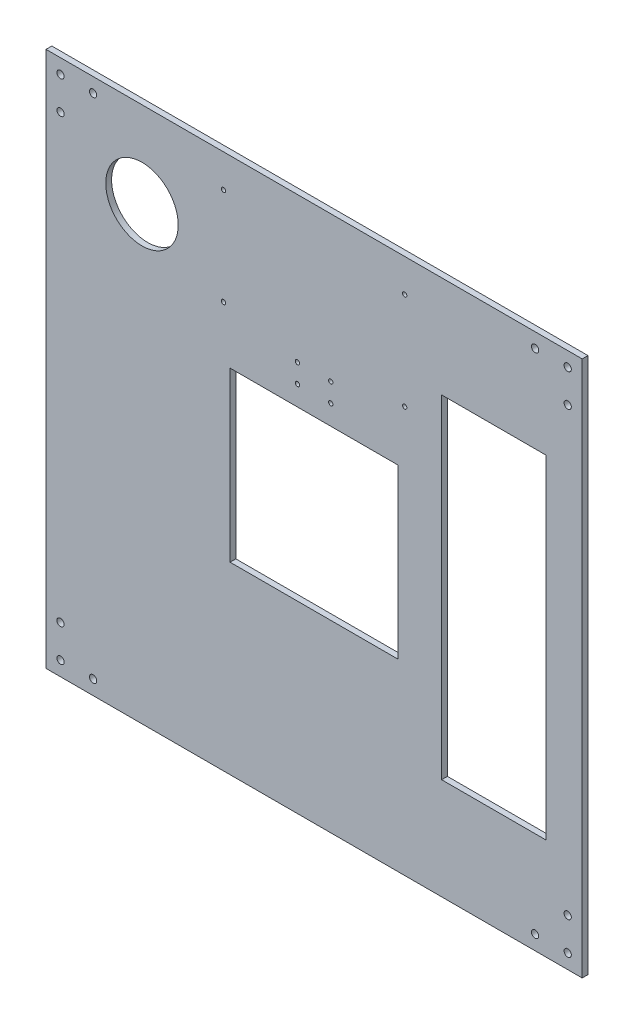
ISO-10303-21;
HEADER;
FILE_DESCRIPTION(('STEP AP214'),'2;1');
FILE_NAME('part.step','',(''),(''),'','','');
FILE_SCHEMA(('AUTOMOTIVE_DESIGN { 1 0 10303 214 1 1 1 1 }'));
ENDSEC;
DATA;
#1=APPLICATION_CONTEXT('core data for automotive mechanical design processes');
#2=APPLICATION_PROTOCOL_DEFINITION('international standard','automotive_design',2000,#1);
#3=PRODUCT_CONTEXT('',#1,'mechanical');
#4=PRODUCT('Part','Part','',(#3));
#5=PRODUCT_RELATED_PRODUCT_CATEGORY('part','',(#4));
#6=PRODUCT_DEFINITION_FORMATION('','',#4);
#7=PRODUCT_DEFINITION_CONTEXT('part definition',#1,'design');
#8=PRODUCT_DEFINITION('design','',#6,#7);
#9=PRODUCT_DEFINITION_SHAPE('','',#8);
#10=(LENGTH_UNIT() NAMED_UNIT(*) SI_UNIT(.MILLI.,.METRE.));
#11=(NAMED_UNIT(*) PLANE_ANGLE_UNIT() SI_UNIT($,.RADIAN.));
#12=(NAMED_UNIT(*) SI_UNIT($,.STERADIAN.) SOLID_ANGLE_UNIT());
#13=UNCERTAINTY_MEASURE_WITH_UNIT(LENGTH_MEASURE(1.E-05),#10,'distance_accuracy_value','');
#14=(GEOMETRIC_REPRESENTATION_CONTEXT(3) GLOBAL_UNCERTAINTY_ASSIGNED_CONTEXT((#13)) GLOBAL_UNIT_ASSIGNED_CONTEXT((#10,
#11,#12)) REPRESENTATION_CONTEXT('',''));
#15=CARTESIAN_POINT('',(0.,0.,0.));
#16=DIRECTION('',(0.,0.,1.));
#17=DIRECTION('',(1.,0.,0.));
#18=AXIS2_PLACEMENT_3D('',#15,#16,#17);
#19=CARTESIAN_POINT('',(-185.,-185.,4.));
#20=DIRECTION('',(1.,0.,0.));
#21=DIRECTION('',(0.,0.,-1.));
#22=AXIS2_PLACEMENT_3D('',#19,#20,#21);
#23=PLANE('',#22);
#24=DIRECTION('',(0.,-1.,0.));
#25=VECTOR('',#24,1.);
#26=CARTESIAN_POINT('',(-185.,-185.,0.));
#27=LINE('',#26,#25);
#28=CARTESIAN_POINT('',(-185.,185.,0.));
#29=VERTEX_POINT('',#28);
#30=CARTESIAN_POINT('',(-185.,-185.,0.));
#31=VERTEX_POINT('',#30);
#32=EDGE_CURVE('E289',#29,#31,#27,.T.);
#33=ORIENTED_EDGE('',*,*,#32,.T.);
#34=DIRECTION('',(0.,0.,-1.));
#35=VECTOR('',#34,1.);
#36=CARTESIAN_POINT('',(-185.,-185.,4.));
#37=LINE('',#36,#35);
#38=CARTESIAN_POINT('',(-185.,-185.,4.));
#39=VERTEX_POINT('',#38);
#40=EDGE_CURVE('E11',#39,#31,#37,.T.);
#41=ORIENTED_EDGE('',*,*,#40,.F.);
#42=DIRECTION('',(0.,-1.,0.));
#43=VECTOR('',#42,1.);
#44=CARTESIAN_POINT('',(-185.,-185.,4.));
#45=LINE('',#44,#43);
#46=CARTESIAN_POINT('',(-185.,185.,4.));
#47=VERTEX_POINT('',#46);
#48=EDGE_CURVE('E292',#47,#39,#45,.T.);
#49=ORIENTED_EDGE('',*,*,#48,.F.);
#50=DIRECTION('',(0.,0.,-1.));
#51=VECTOR('',#50,1.);
#52=CARTESIAN_POINT('',(-185.,185.,4.));
#53=LINE('',#52,#51);
#54=EDGE_CURVE('E302',#47,#29,#53,.T.);
#55=ORIENTED_EDGE('',*,*,#54,.T.);
#56=EDGE_LOOP('',(#33,#41,#49,#55));
#57=FACE_BOUND('',#56,.T.);
#58=ADVANCED_FACE('F37',(#57),#23,.F.);
#59=CARTESIAN_POINT('',(185.,-185.,4.));
#60=DIRECTION('',(0.,1.,0.));
#61=DIRECTION('',(-1.,0.,0.));
#62=AXIS2_PLACEMENT_3D('',#59,#60,#61);
#63=PLANE('',#62);
#64=DIRECTION('',(1.,0.,0.));
#65=VECTOR('',#64,1.);
#66=CARTESIAN_POINT('',(185.,-185.,0.));
#67=LINE('',#66,#65);
#68=CARTESIAN_POINT('',(185.,-185.,0.));
#69=VERTEX_POINT('',#68);
#70=EDGE_CURVE('E305',#31,#69,#67,.T.);
#71=ORIENTED_EDGE('',*,*,#70,.T.);
#72=DIRECTION('',(0.,0.,-1.));
#73=VECTOR('',#72,1.);
#74=CARTESIAN_POINT('',(185.,-185.,4.));
#75=LINE('',#74,#73);
#76=CARTESIAN_POINT('',(185.,-185.,4.));
#77=VERTEX_POINT('',#76);
#78=EDGE_CURVE('E44',#77,#69,#75,.T.);
#79=ORIENTED_EDGE('',*,*,#78,.F.);
#80=DIRECTION('',(1.,0.,0.));
#81=VECTOR('',#80,1.);
#82=CARTESIAN_POINT('',(185.,-185.,4.));
#83=LINE('',#82,#81);
#84=EDGE_CURVE('E295',#39,#77,#83,.T.);
#85=ORIENTED_EDGE('',*,*,#84,.F.);
#86=ORIENTED_EDGE('',*,*,#40,.T.);
#87=EDGE_LOOP('',(#71,#79,#85,#86));
#88=FACE_BOUND('',#87,.T.);
#89=ADVANCED_FACE('F334',(#88),#63,.F.);
#90=CARTESIAN_POINT('',(185.,-185.,4.));
#91=DIRECTION('',(-1.,0.,0.));
#92=DIRECTION('',(0.,0.,1.));
#93=AXIS2_PLACEMENT_3D('',#90,#91,#92);
#94=PLANE('',#93);
#95=DIRECTION('',(0.,1.,0.));
#96=VECTOR('',#95,1.);
#97=CARTESIAN_POINT('',(185.,-185.,0.));
#98=LINE('',#97,#96);
#99=CARTESIAN_POINT('',(185.,185.,0.));
#100=VERTEX_POINT('',#99);
#101=EDGE_CURVE('E307',#69,#100,#98,.T.);
#102=ORIENTED_EDGE('',*,*,#101,.T.);
#103=DIRECTION('',(0.,0.,-1.));
#104=VECTOR('',#103,1.);
#105=CARTESIAN_POINT('',(185.,185.,4.));
#106=LINE('',#105,#104);
#107=CARTESIAN_POINT('',(185.,185.,4.));
#108=VERTEX_POINT('',#107);
#109=EDGE_CURVE('E312',#108,#100,#106,.T.);
#110=ORIENTED_EDGE('',*,*,#109,.F.);
#111=DIRECTION('',(0.,1.,0.));
#112=VECTOR('',#111,1.);
#113=CARTESIAN_POINT('',(185.,-185.,4.));
#114=LINE('',#113,#112);
#115=EDGE_CURVE('E298',#77,#108,#114,.T.);
#116=ORIENTED_EDGE('',*,*,#115,.F.);
#117=ORIENTED_EDGE('',*,*,#78,.T.);
#118=EDGE_LOOP('',(#102,#110,#116,#117));
#119=FACE_BOUND('',#118,.T.);
#120=ADVANCED_FACE('F319',(#119),#94,.F.);
#121=CARTESIAN_POINT('',(185.,185.,4.));
#122=DIRECTION('',(0.,-1.,0.));
#123=DIRECTION('',(1.,0.,0.));
#124=AXIS2_PLACEMENT_3D('',#121,#122,#123);
#125=PLANE('',#124);
#126=DIRECTION('',(-1.,0.,0.));
#127=VECTOR('',#126,1.);
#128=CARTESIAN_POINT('',(185.,185.,0.));
#129=LINE('',#128,#127);
#130=EDGE_CURVE('E296',#100,#29,#129,.T.);
#131=ORIENTED_EDGE('',*,*,#130,.T.);
#132=ORIENTED_EDGE('',*,*,#54,.F.);
#133=DIRECTION('',(-1.,0.,0.));
#134=VECTOR('',#133,1.);
#135=CARTESIAN_POINT('',(185.,185.,4.));
#136=LINE('',#135,#134);
#137=EDGE_CURVE('E300',#108,#47,#136,.T.);
#138=ORIENTED_EDGE('',*,*,#137,.F.);
#139=ORIENTED_EDGE('',*,*,#109,.T.);
#140=EDGE_LOOP('',(#131,#132,#138,#139));
#141=FACE_BOUND('',#140,.T.);
#142=ADVANCED_FACE('F327',(#141),#125,.F.);
#143=CARTESIAN_POINT('',(0.,0.,4.));
#144=DIRECTION('',(0.,0.,1.));
#145=DIRECTION('',(1.,0.,0.));
#146=AXIS2_PLACEMENT_3D('',#143,#144,#145);
#147=PLANE('',#146);
#148=CARTESIAN_POINT('',(-11.5,71.7320508075689,4.));
#149=DIRECTION('',(0.,0.,-1.));
#150=DIRECTION('',(-1.,0.,0.));
#151=AXIS2_PLACEMENT_3D('',#148,#149,#150);
#152=CIRCLE('',#151,1.5);
#153=CARTESIAN_POINT('',(-13.,71.7320508075689,4.));
#154=VERTEX_POINT('',#153);
#155=EDGE_CURVE('E481',#154,#154,#152,.T.);
#156=ORIENTED_EDGE('',*,*,#155,.T.);
#157=EDGE_LOOP('',(#156));
#158=FACE_BOUND('',#157,.T.);
#159=CARTESIAN_POINT('',(11.5,84.7320508075689,4.));
#160=DIRECTION('',(0.,0.,-1.));
#161=DIRECTION('',(-1.,0.,0.));
#162=AXIS2_PLACEMENT_3D('',#159,#160,#161);
#163=CIRCLE('',#162,1.5);
#164=CARTESIAN_POINT('',(10.,84.7320508075689,4.));
#165=VERTEX_POINT('',#164);
#166=EDGE_CURVE('E470',#165,#165,#163,.T.);
#167=ORIENTED_EDGE('',*,*,#166,.T.);
#168=EDGE_LOOP('',(#167));
#169=FACE_BOUND('',#168,.T.);
#170=CARTESIAN_POINT('',(-11.5,84.7320508075689,4.));
#171=DIRECTION('',(0.,0.,-1.));
#172=DIRECTION('',(-1.,0.,0.));
#173=AXIS2_PLACEMENT_3D('',#170,#171,#172);
#174=CIRCLE('',#173,1.5);
#175=CARTESIAN_POINT('',(-13.,84.7320508075689,4.));
#176=VERTEX_POINT('',#175);
#177=EDGE_CURVE('E465',#176,#176,#174,.T.);
#178=ORIENTED_EDGE('',*,*,#177,.T.);
#179=EDGE_LOOP('',(#178));
#180=FACE_BOUND('',#179,.T.);
#181=CARTESIAN_POINT('',(11.5,71.7320508075689,4.));
#182=DIRECTION('',(0.,0.,-1.));
#183=DIRECTION('',(-1.,0.,0.));
#184=AXIS2_PLACEMENT_3D('',#181,#182,#183);
#185=CIRCLE('',#184,1.5);
#186=CARTESIAN_POINT('',(10.,71.7320508075689,4.));
#187=VERTEX_POINT('',#186);
#188=EDGE_CURVE('E486',#187,#187,#185,.T.);
#189=ORIENTED_EDGE('',*,*,#188,.T.);
#190=EDGE_LOOP('',(#189));
#191=FACE_BOUND('',#190,.T.);
#192=DIRECTION('',(0.,1.,0.));
#193=VECTOR('',#192,1.);
#194=CARTESIAN_POINT('',(160.,0.,4.));
#195=LINE('',#194,#193);
#196=CARTESIAN_POINT('',(160.,-115.,4.));
#197=VERTEX_POINT('',#196);
#198=CARTESIAN_POINT('',(160.,115.,4.));
#199=VERTEX_POINT('',#198);
#200=EDGE_CURVE('E158',#197,#199,#195,.T.);
#201=ORIENTED_EDGE('',*,*,#200,.F.);
#202=DIRECTION('',(1.,0.,0.));
#203=VECTOR('',#202,1.);
#204=CARTESIAN_POINT('',(0.,-115.,4.));
#205=LINE('',#204,#203);
#206=CARTESIAN_POINT('',(88.,-115.,4.));
#207=VERTEX_POINT('',#206);
#208=EDGE_CURVE('E151',#207,#197,#205,.T.);
#209=ORIENTED_EDGE('',*,*,#208,.F.);
#210=DIRECTION('',(0.,-1.,0.));
#211=VECTOR('',#210,1.);
#212=CARTESIAN_POINT('',(88.,0.,4.));
#213=LINE('',#212,#211);
#214=CARTESIAN_POINT('',(88.,115.,4.));
#215=VERTEX_POINT('',#214);
#216=EDGE_CURVE('E131',#215,#207,#213,.T.);
#217=ORIENTED_EDGE('',*,*,#216,.F.);
#218=DIRECTION('',(-1.,0.,0.));
#219=VECTOR('',#218,1.);
#220=CARTESIAN_POINT('',(0.,115.,4.));
#221=LINE('',#220,#219);
#222=EDGE_CURVE('E156',#199,#215,#221,.T.);
#223=ORIENTED_EDGE('',*,*,#222,.F.);
#224=EDGE_LOOP('',(#201,#209,#217,#223));
#225=FACE_BOUND('',#224,.T.);
#226=DIRECTION('',(0.,1.,0.));
#227=VECTOR('',#226,1.);
#228=CARTESIAN_POINT('',(58.,0.,4.));
#229=LINE('',#228,#227);
#230=CARTESIAN_POINT('',(58.,-58.,4.));
#231=VERTEX_POINT('',#230);
#232=CARTESIAN_POINT('',(58.,58.,4.));
#233=VERTEX_POINT('',#232);
#234=EDGE_CURVE('E187',#231,#233,#229,.T.);
#235=ORIENTED_EDGE('',*,*,#234,.F.);
#236=DIRECTION('',(1.,0.,0.));
#237=VECTOR('',#236,1.);
#238=CARTESIAN_POINT('',(0.,-58.,4.));
#239=LINE('',#238,#237);
#240=CARTESIAN_POINT('',(-58.,-58.,4.));
#241=VERTEX_POINT('',#240);
#242=EDGE_CURVE('E174',#241,#231,#239,.T.);
#243=ORIENTED_EDGE('',*,*,#242,.F.);
#244=DIRECTION('',(0.,-1.,0.));
#245=VECTOR('',#244,1.);
#246=CARTESIAN_POINT('',(-58.,0.,4.));
#247=LINE('',#246,#245);
#248=CARTESIAN_POINT('',(-58.,58.,4.));
#249=VERTEX_POINT('',#248);
#250=EDGE_CURVE('E182',#249,#241,#247,.T.);
#251=ORIENTED_EDGE('',*,*,#250,.F.);
#252=DIRECTION('',(-1.,0.,0.));
#253=VECTOR('',#252,1.);
#254=CARTESIAN_POINT('',(0.,58.,4.));
#255=LINE('',#254,#253);
#256=EDGE_CURVE('E185',#233,#249,#255,.T.);
#257=ORIENTED_EDGE('',*,*,#256,.F.);
#258=EDGE_LOOP('',(#235,#243,#251,#257));
#259=FACE_BOUND('',#258,.T.);
#260=CARTESIAN_POINT('',(-118.76985494899,125.631801741306,4.));
#261=DIRECTION('',(0.,0.,-1.));
#262=DIRECTION('',(-1.,0.,0.));
#263=AXIS2_PLACEMENT_3D('',#260,#261,#262);
#264=CIRCLE('',#263,25.);
#265=CARTESIAN_POINT('',(-143.76985494899,125.631801741306,4.));
#266=VERTEX_POINT('',#265);
#267=EDGE_CURVE('E190',#266,#266,#264,.T.);
#268=ORIENTED_EDGE('',*,*,#267,.T.);
#269=EDGE_LOOP('',(#268));
#270=FACE_BOUND('',#269,.T.);
#271=CARTESIAN_POINT('',(-62.5,95.2497952517391,4.));
#272=DIRECTION('',(0.,0.,-1.));
#273=DIRECTION('',(-1.,0.,0.));
#274=AXIS2_PLACEMENT_3D('',#271,#272,#273);
#275=CIRCLE('',#274,1.5);
#276=CARTESIAN_POINT('',(-64.,95.2497952517391,4.));
#277=VERTEX_POINT('',#276);
#278=EDGE_CURVE('E206',#277,#277,#275,.T.);
#279=ORIENTED_EDGE('',*,*,#278,.T.);
#280=EDGE_LOOP('',(#279));
#281=FACE_BOUND('',#280,.T.);
#282=CARTESIAN_POINT('',(62.5,162.249795251739,4.));
#283=DIRECTION('',(0.,0.,-1.));
#284=DIRECTION('',(-1.,0.,0.));
#285=AXIS2_PLACEMENT_3D('',#282,#283,#284);
#286=CIRCLE('',#285,1.5);
#287=CARTESIAN_POINT('',(61.,162.249795251739,4.));
#288=VERTEX_POINT('',#287);
#289=EDGE_CURVE('E199',#288,#288,#286,.T.);
#290=ORIENTED_EDGE('',*,*,#289,.T.);
#291=EDGE_LOOP('',(#290));
#292=FACE_BOUND('',#291,.T.);
#293=CARTESIAN_POINT('',(-62.5,162.249795251739,4.));
#294=DIRECTION('',(0.,0.,-1.));
#295=DIRECTION('',(-1.,0.,0.));
#296=AXIS2_PLACEMENT_3D('',#293,#294,#295);
#297=CIRCLE('',#296,1.5);
#298=CARTESIAN_POINT('',(-64.,162.249795251739,4.));
#299=VERTEX_POINT('',#298);
#300=EDGE_CURVE('E193',#299,#299,#297,.T.);
#301=ORIENTED_EDGE('',*,*,#300,.T.);
#302=EDGE_LOOP('',(#301));
#303=FACE_BOUND('',#302,.T.);
#304=CARTESIAN_POINT('',(62.5,95.2497952517391,4.));
#305=DIRECTION('',(0.,0.,-1.));
#306=DIRECTION('',(-1.,0.,0.));
#307=AXIS2_PLACEMENT_3D('',#304,#305,#306);
#308=CIRCLE('',#307,1.5);
#309=CARTESIAN_POINT('',(61.,95.2497952517391,4.));
#310=VERTEX_POINT('',#309);
#311=EDGE_CURVE('E214',#310,#310,#308,.T.);
#312=ORIENTED_EDGE('',*,*,#311,.T.);
#313=EDGE_LOOP('',(#312));
#314=FACE_BOUND('',#313,.T.);
#315=CARTESIAN_POINT('',(-152.499999999999,175.000000000001,4.));
#316=DIRECTION('',(0.,0.,1.));
#317=DIRECTION('',(1.,0.,0.));
#318=AXIS2_PLACEMENT_3D('',#315,#316,#317);
#319=CIRCLE('',#318,2.5);
#320=CARTESIAN_POINT('',(-149.999999999999,175.000000000001,4.));
#321=VERTEX_POINT('',#320);
#322=EDGE_CURVE('E250',#321,#321,#319,.T.);
#323=ORIENTED_EDGE('',*,*,#322,.F.);
#324=EDGE_LOOP('',(#323));
#325=FACE_BOUND('',#324,.T.);
#326=CARTESIAN_POINT('',(175.000000000001,174.999999999999,4.));
#327=DIRECTION('',(0.,0.,1.));
#328=DIRECTION('',(1.,0.,0.));
#329=AXIS2_PLACEMENT_3D('',#326,#327,#328);
#330=CIRCLE('',#329,2.49999999999999);
#331=CARTESIAN_POINT('',(177.500000000001,174.999999999999,4.));
#332=VERTEX_POINT('',#331);
#333=EDGE_CURVE('E257',#332,#332,#330,.T.);
#334=ORIENTED_EDGE('',*,*,#333,.F.);
#335=EDGE_LOOP('',(#334));
#336=FACE_BOUND('',#335,.T.);
#337=CARTESIAN_POINT('',(152.500000000001,174.999999999999,4.));
#338=DIRECTION('',(0.,0.,1.));
#339=DIRECTION('',(1.,0.,0.));
#340=AXIS2_PLACEMENT_3D('',#337,#338,#339);
#341=CIRCLE('',#340,2.5);
#342=CARTESIAN_POINT('',(155.000000000001,174.999999999999,4.));
#343=VERTEX_POINT('',#342);
#344=EDGE_CURVE('E238',#343,#343,#341,.T.);
#345=ORIENTED_EDGE('',*,*,#344,.F.);
#346=EDGE_LOOP('',(#345));
#347=FACE_BOUND('',#346,.T.);
#348=CARTESIAN_POINT('',(175.000000000001,152.499999999999,4.));
#349=DIRECTION('',(0.,0.,1.));
#350=DIRECTION('',(1.,0.,0.));
#351=AXIS2_PLACEMENT_3D('',#348,#349,#350);
#352=CIRCLE('',#351,2.49999999999999);
#353=CARTESIAN_POINT('',(177.500000000001,152.499999999999,4.));
#354=VERTEX_POINT('',#353);
#355=EDGE_CURVE('E245',#354,#354,#352,.T.);
#356=ORIENTED_EDGE('',*,*,#355,.F.);
#357=EDGE_LOOP('',(#356));
#358=FACE_BOUND('',#357,.T.);
#359=CARTESIAN_POINT('',(-174.999999999999,152.500000000001,4.));
#360=DIRECTION('',(0.,0.,1.));
#361=DIRECTION('',(1.,0.,0.));
#362=AXIS2_PLACEMENT_3D('',#359,#360,#361);
#363=CIRCLE('',#362,2.5);
#364=CARTESIAN_POINT('',(-172.499999999999,152.500000000001,4.));
#365=VERTEX_POINT('',#364);
#366=EDGE_CURVE('E281',#365,#365,#363,.T.);
#367=ORIENTED_EDGE('',*,*,#366,.F.);
#368=EDGE_LOOP('',(#367));
#369=FACE_BOUND('',#368,.T.);
#370=CARTESIAN_POINT('',(-174.999999999999,175.000000000001,4.));
#371=DIRECTION('',(0.,0.,1.));
#372=DIRECTION('',(1.,0.,0.));
#373=AXIS2_PLACEMENT_3D('',#370,#371,#372);
#374=CIRCLE('',#373,2.5);
#375=CARTESIAN_POINT('',(-172.499999999999,175.000000000001,4.));
#376=VERTEX_POINT('',#375);
#377=EDGE_CURVE('E275',#376,#376,#374,.T.);
#378=ORIENTED_EDGE('',*,*,#377,.F.);
#379=EDGE_LOOP('',(#378));
#380=FACE_BOUND('',#379,.T.);
#381=CARTESIAN_POINT('',(-175.,-152.5,4.));
#382=DIRECTION('',(0.,0.,1.));
#383=DIRECTION('',(1.,0.,0.));
#384=AXIS2_PLACEMENT_3D('',#381,#382,#383);
#385=CIRCLE('',#384,2.5);
#386=CARTESIAN_POINT('',(-172.5,-152.5,4.));
#387=VERTEX_POINT('',#386);
#388=EDGE_CURVE('E269',#387,#387,#385,.T.);
#389=ORIENTED_EDGE('',*,*,#388,.F.);
#390=EDGE_LOOP('',(#389));
#391=FACE_BOUND('',#390,.T.);
#392=CARTESIAN_POINT('',(-152.5,-175.,4.));
#393=DIRECTION('',(0.,0.,1.));
#394=DIRECTION('',(1.,0.,0.));
#395=AXIS2_PLACEMENT_3D('',#392,#393,#394);
#396=CIRCLE('',#395,2.5);
#397=CARTESIAN_POINT('',(-150.,-175.,4.));
#398=VERTEX_POINT('',#397);
#399=EDGE_CURVE('E262',#398,#398,#396,.T.);
#400=ORIENTED_EDGE('',*,*,#399,.F.);
#401=EDGE_LOOP('',(#400));
#402=FACE_BOUND('',#401,.T.);
#403=CARTESIAN_POINT('',(174.999999999998,-175.000000000002,4.));
#404=DIRECTION('',(0.,0.,1.));
#405=DIRECTION('',(1.,0.,0.));
#406=AXIS2_PLACEMENT_3D('',#403,#404,#405);
#407=CIRCLE('',#406,2.49999999999999);
#408=CARTESIAN_POINT('',(177.499999999998,-175.000000000002,4.));
#409=VERTEX_POINT('',#408);
#410=EDGE_CURVE('E220',#409,#409,#407,.T.);
#411=ORIENTED_EDGE('',*,*,#410,.F.);
#412=EDGE_LOOP('',(#411));
#413=FACE_BOUND('',#412,.T.);
#414=CARTESIAN_POINT('',(174.999999999998,-152.500000000002,4.));
#415=DIRECTION('',(0.,0.,1.));
#416=DIRECTION('',(1.,0.,0.));
#417=AXIS2_PLACEMENT_3D('',#414,#415,#416);
#418=CIRCLE('',#417,2.49999999999999);
#419=CARTESIAN_POINT('',(177.499999999998,-152.500000000002,4.));
#420=VERTEX_POINT('',#419);
#421=EDGE_CURVE('E227',#420,#420,#418,.T.);
#422=ORIENTED_EDGE('',*,*,#421,.F.);
#423=EDGE_LOOP('',(#422));
#424=FACE_BOUND('',#423,.T.);
#425=CARTESIAN_POINT('',(152.499999999998,-175.000000000002,4.));
#426=DIRECTION('',(0.,0.,1.));
#427=DIRECTION('',(1.,0.,0.));
#428=AXIS2_PLACEMENT_3D('',#425,#426,#427);
#429=CIRCLE('',#428,2.50000000000001);
#430=CARTESIAN_POINT('',(154.999999999998,-175.000000000002,4.));
#431=VERTEX_POINT('',#430);
#432=EDGE_CURVE('E233',#431,#431,#429,.T.);
#433=ORIENTED_EDGE('',*,*,#432,.F.);
#434=EDGE_LOOP('',(#433));
#435=FACE_BOUND('',#434,.T.);
#436=CARTESIAN_POINT('',(-175.,-175.,4.));
#437=DIRECTION('',(0.,0.,1.));
#438=DIRECTION('',(1.,0.,0.));
#439=AXIS2_PLACEMENT_3D('',#436,#437,#438);
#440=CIRCLE('',#439,2.5);
#441=CARTESIAN_POINT('',(-172.5,-175.,4.));
#442=VERTEX_POINT('',#441);
#443=EDGE_CURVE('E265',#442,#442,#440,.T.);
#444=ORIENTED_EDGE('',*,*,#443,.F.);
#445=EDGE_LOOP('',(#444));
#446=FACE_BOUND('',#445,.T.);
#447=ORIENTED_EDGE('',*,*,#48,.T.);
#448=ORIENTED_EDGE('',*,*,#84,.T.);
#449=ORIENTED_EDGE('',*,*,#115,.T.);
#450=ORIENTED_EDGE('',*,*,#137,.T.);
#451=EDGE_LOOP('',(#447,#448,#449,#450));
#452=FACE_BOUND('',#451,.T.);
#453=ADVANCED_FACE('F333',(#158,#169,#180,#191,#225,#259,#270,#281,#292,#303,#314,#325,#336,
#347,#358,#369,#380,#391,#402,#413,#424,#435,#446,#452),#147,.T.);
#454=CARTESIAN_POINT('',(0.,0.,0.));
#455=DIRECTION('',(0.,0.,1.));
#456=DIRECTION('',(1.,0.,0.));
#457=AXIS2_PLACEMENT_3D('',#454,#455,#456);
#458=PLANE('',#457);
#459=CARTESIAN_POINT('',(-11.5,71.7320508075689,0.));
#460=DIRECTION('',(0.,0.,-1.));
#461=DIRECTION('',(-1.,0.,0.));
#462=AXIS2_PLACEMENT_3D('',#459,#460,#461);
#463=CIRCLE('',#462,1.5);
#464=CARTESIAN_POINT('',(-13.,71.7320508075689,0.));
#465=VERTEX_POINT('',#464);
#466=EDGE_CURVE('E477',#465,#465,#463,.T.);
#467=ORIENTED_EDGE('',*,*,#466,.F.);
#468=EDGE_LOOP('',(#467));
#469=FACE_BOUND('',#468,.T.);
#470=CARTESIAN_POINT('',(11.5,84.7320508075689,0.));
#471=DIRECTION('',(0.,0.,-1.));
#472=DIRECTION('',(-1.,0.,0.));
#473=AXIS2_PLACEMENT_3D('',#470,#471,#472);
#474=CIRCLE('',#473,1.5);
#475=CARTESIAN_POINT('',(10.,84.7320508075689,0.));
#476=VERTEX_POINT('',#475);
#477=EDGE_CURVE('E473',#476,#476,#474,.T.);
#478=ORIENTED_EDGE('',*,*,#477,.F.);
#479=EDGE_LOOP('',(#478));
#480=FACE_BOUND('',#479,.T.);
#481=CARTESIAN_POINT('',(-11.5,84.7320508075689,0.));
#482=DIRECTION('',(0.,0.,-1.));
#483=DIRECTION('',(-1.,0.,0.));
#484=AXIS2_PLACEMENT_3D('',#481,#482,#483);
#485=CIRCLE('',#484,1.5);
#486=CARTESIAN_POINT('',(-13.,84.7320508075689,0.));
#487=VERTEX_POINT('',#486);
#488=EDGE_CURVE('E468',#487,#487,#485,.T.);
#489=ORIENTED_EDGE('',*,*,#488,.F.);
#490=EDGE_LOOP('',(#489));
#491=FACE_BOUND('',#490,.T.);
#492=CARTESIAN_POINT('',(11.5,71.7320508075689,0.));
#493=DIRECTION('',(0.,0.,-1.));
#494=DIRECTION('',(-1.,0.,0.));
#495=AXIS2_PLACEMENT_3D('',#492,#493,#494);
#496=CIRCLE('',#495,1.5);
#497=CARTESIAN_POINT('',(10.,71.7320508075689,0.));
#498=VERTEX_POINT('',#497);
#499=EDGE_CURVE('E480',#498,#498,#496,.T.);
#500=ORIENTED_EDGE('',*,*,#499,.F.);
#501=EDGE_LOOP('',(#500));
#502=FACE_BOUND('',#501,.T.);
#503=DIRECTION('',(-1.,0.,0.));
#504=VECTOR('',#503,1.);
#505=CARTESIAN_POINT('',(88.,-115.,0.));
#506=LINE('',#505,#504);
#507=CARTESIAN_POINT('',(160.,-115.,0.));
#508=VERTEX_POINT('',#507);
#509=CARTESIAN_POINT('',(88.,-115.,0.));
#510=VERTEX_POINT('',#509);
#511=EDGE_CURVE('E137',#508,#510,#506,.T.);
#512=ORIENTED_EDGE('',*,*,#511,.F.);
#513=DIRECTION('',(0.,-1.,0.));
#514=VECTOR('',#513,1.);
#515=CARTESIAN_POINT('',(160.,-115.,0.));
#516=LINE('',#515,#514);
#517=CARTESIAN_POINT('',(160.,115.,0.));
#518=VERTEX_POINT('',#517);
#519=EDGE_CURVE('E59',#518,#508,#516,.T.);
#520=ORIENTED_EDGE('',*,*,#519,.F.);
#521=DIRECTION('',(1.,0.,0.));
#522=VECTOR('',#521,1.);
#523=CARTESIAN_POINT('',(88.,115.,0.));
#524=LINE('',#523,#522);
#525=CARTESIAN_POINT('',(88.,115.,0.));
#526=VERTEX_POINT('',#525);
#527=EDGE_CURVE('E144',#526,#518,#524,.T.);
#528=ORIENTED_EDGE('',*,*,#527,.F.);
#529=DIRECTION('',(0.,1.,0.));
#530=VECTOR('',#529,1.);
#531=CARTESIAN_POINT('',(88.,-115.,0.));
#532=LINE('',#531,#530);
#533=EDGE_CURVE('E128',#510,#526,#532,.T.);
#534=ORIENTED_EDGE('',*,*,#533,.F.);
#535=EDGE_LOOP('',(#512,#520,#528,#534));
#536=FACE_BOUND('',#535,.T.);
#537=DIRECTION('',(-1.,0.,0.));
#538=VECTOR('',#537,1.);
#539=CARTESIAN_POINT('',(-58.,-58.,0.));
#540=LINE('',#539,#538);
#541=CARTESIAN_POINT('',(58.,-58.,0.));
#542=VERTEX_POINT('',#541);
#543=CARTESIAN_POINT('',(-58.,-58.,0.));
#544=VERTEX_POINT('',#543);
#545=EDGE_CURVE('E162',#542,#544,#540,.T.);
#546=ORIENTED_EDGE('',*,*,#545,.F.);
#547=DIRECTION('',(0.,-1.,0.));
#548=VECTOR('',#547,1.);
#549=CARTESIAN_POINT('',(58.,-58.,0.));
#550=LINE('',#549,#548);
#551=CARTESIAN_POINT('',(58.,58.,0.));
#552=VERTEX_POINT('',#551);
#553=EDGE_CURVE('E160',#552,#542,#550,.T.);
#554=ORIENTED_EDGE('',*,*,#553,.F.);
#555=DIRECTION('',(1.,0.,0.));
#556=VECTOR('',#555,1.);
#557=CARTESIAN_POINT('',(-58.,58.,0.));
#558=LINE('',#557,#556);
#559=CARTESIAN_POINT('',(-58.,58.,0.));
#560=VERTEX_POINT('',#559);
#561=EDGE_CURVE('E168',#560,#552,#558,.T.);
#562=ORIENTED_EDGE('',*,*,#561,.F.);
#563=DIRECTION('',(0.,1.,0.));
#564=VECTOR('',#563,1.);
#565=CARTESIAN_POINT('',(-58.,-58.,0.));
#566=LINE('',#565,#564);
#567=EDGE_CURVE('E165',#544,#560,#566,.T.);
#568=ORIENTED_EDGE('',*,*,#567,.F.);
#569=EDGE_LOOP('',(#546,#554,#562,#568));
#570=FACE_BOUND('',#569,.T.);
#571=CARTESIAN_POINT('',(-118.76985494899,125.631801741306,0.));
#572=DIRECTION('',(0.,0.,-1.));
#573=DIRECTION('',(-1.,0.,0.));
#574=AXIS2_PLACEMENT_3D('',#571,#572,#573);
#575=CIRCLE('',#574,25.);
#576=CARTESIAN_POINT('',(-143.76985494899,125.631801741306,0.));
#577=VERTEX_POINT('',#576);
#578=EDGE_CURVE('E189',#577,#577,#575,.T.);
#579=ORIENTED_EDGE('',*,*,#578,.F.);
#580=EDGE_LOOP('',(#579));
#581=FACE_BOUND('',#580,.T.);
#582=CARTESIAN_POINT('',(-62.5,95.2497952517391,0.));
#583=DIRECTION('',(0.,0.,-1.));
#584=DIRECTION('',(-1.,0.,0.));
#585=AXIS2_PLACEMENT_3D('',#582,#583,#584);
#586=CIRCLE('',#585,1.5);
#587=CARTESIAN_POINT('',(-64.,95.2497952517391,0.));
#588=VERTEX_POINT('',#587);
#589=EDGE_CURVE('E202',#588,#588,#586,.T.);
#590=ORIENTED_EDGE('',*,*,#589,.F.);
#591=EDGE_LOOP('',(#590));
#592=FACE_BOUND('',#591,.T.);
#593=CARTESIAN_POINT('',(62.5,162.249795251739,0.));
#594=DIRECTION('',(0.,0.,-1.));
#595=DIRECTION('',(-1.,0.,0.));
#596=AXIS2_PLACEMENT_3D('',#593,#594,#595);
#597=CIRCLE('',#596,1.5);
#598=CARTESIAN_POINT('',(61.,162.249795251739,0.));
#599=VERTEX_POINT('',#598);
#600=EDGE_CURVE('E209',#599,#599,#597,.T.);
#601=ORIENTED_EDGE('',*,*,#600,.F.);
#602=EDGE_LOOP('',(#601));
#603=FACE_BOUND('',#602,.T.);
#604=CARTESIAN_POINT('',(-62.5,162.249795251739,0.));
#605=DIRECTION('',(0.,0.,-1.));
#606=DIRECTION('',(-1.,0.,0.));
#607=AXIS2_PLACEMENT_3D('',#604,#605,#606);
#608=CIRCLE('',#607,1.5);
#609=CARTESIAN_POINT('',(-64.,162.249795251739,0.));
#610=VERTEX_POINT('',#609);
#611=EDGE_CURVE('E196',#610,#610,#608,.T.);
#612=ORIENTED_EDGE('',*,*,#611,.F.);
#613=EDGE_LOOP('',(#612));
#614=FACE_BOUND('',#613,.T.);
#615=CARTESIAN_POINT('',(62.5,95.2497952517391,0.));
#616=DIRECTION('',(0.,0.,-1.));
#617=DIRECTION('',(-1.,0.,0.));
#618=AXIS2_PLACEMENT_3D('',#615,#616,#617);
#619=CIRCLE('',#618,1.5);
#620=CARTESIAN_POINT('',(61.,95.2497952517391,0.));
#621=VERTEX_POINT('',#620);
#622=EDGE_CURVE('E205',#621,#621,#619,.T.);
#623=ORIENTED_EDGE('',*,*,#622,.F.);
#624=EDGE_LOOP('',(#623));
#625=FACE_BOUND('',#624,.T.);
#626=CARTESIAN_POINT('',(-152.499999999999,175.000000000001,0.));
#627=DIRECTION('',(0.,0.,1.));
#628=DIRECTION('',(1.,0.,0.));
#629=AXIS2_PLACEMENT_3D('',#626,#627,#628);
#630=CIRCLE('',#629,2.5);
#631=CARTESIAN_POINT('',(-149.999999999999,175.000000000001,0.));
#632=VERTEX_POINT('',#631);
#633=EDGE_CURVE('E254',#632,#632,#630,.T.);
#634=ORIENTED_EDGE('',*,*,#633,.T.);
#635=EDGE_LOOP('',(#634));
#636=FACE_BOUND('',#635,.T.);
#637=CARTESIAN_POINT('',(175.000000000001,174.999999999999,0.));
#638=DIRECTION('',(0.,0.,1.));
#639=DIRECTION('',(1.,0.,0.));
#640=AXIS2_PLACEMENT_3D('',#637,#638,#639);
#641=CIRCLE('',#640,2.49999999999999);
#642=CARTESIAN_POINT('',(177.500000000001,174.999999999999,0.));
#643=VERTEX_POINT('',#642);
#644=EDGE_CURVE('E241',#643,#643,#641,.T.);
#645=ORIENTED_EDGE('',*,*,#644,.T.);
#646=EDGE_LOOP('',(#645));
#647=FACE_BOUND('',#646,.T.);
#648=CARTESIAN_POINT('',(152.500000000001,174.999999999999,0.));
#649=DIRECTION('',(0.,0.,1.));
#650=DIRECTION('',(1.,0.,0.));
#651=AXIS2_PLACEMENT_3D('',#648,#649,#650);
#652=CIRCLE('',#651,2.5);
#653=CARTESIAN_POINT('',(155.000000000001,174.999999999999,0.));
#654=VERTEX_POINT('',#653);
#655=EDGE_CURVE('E242',#654,#654,#652,.T.);
#656=ORIENTED_EDGE('',*,*,#655,.T.);
#657=EDGE_LOOP('',(#656));
#658=FACE_BOUND('',#657,.T.);
#659=CARTESIAN_POINT('',(175.000000000001,152.499999999999,0.));
#660=DIRECTION('',(0.,0.,1.));
#661=DIRECTION('',(1.,0.,0.));
#662=AXIS2_PLACEMENT_3D('',#659,#660,#661);
#663=CIRCLE('',#662,2.49999999999999);
#664=CARTESIAN_POINT('',(177.500000000001,152.499999999999,0.));
#665=VERTEX_POINT('',#664);
#666=EDGE_CURVE('E223',#665,#665,#663,.T.);
#667=ORIENTED_EDGE('',*,*,#666,.T.);
#668=EDGE_LOOP('',(#667));
#669=FACE_BOUND('',#668,.T.);
#670=CARTESIAN_POINT('',(-174.999999999999,152.500000000001,0.));
#671=DIRECTION('',(0.,0.,1.));
#672=DIRECTION('',(1.,0.,0.));
#673=AXIS2_PLACEMENT_3D('',#670,#671,#672);
#674=CIRCLE('',#673,2.5);
#675=CARTESIAN_POINT('',(-172.499999999999,152.500000000001,0.));
#676=VERTEX_POINT('',#675);
#677=EDGE_CURVE('E253',#676,#676,#674,.T.);
#678=ORIENTED_EDGE('',*,*,#677,.T.);
#679=EDGE_LOOP('',(#678));
#680=FACE_BOUND('',#679,.T.);
#681=CARTESIAN_POINT('',(-174.999999999999,175.000000000001,0.));
#682=DIRECTION('',(0.,0.,1.));
#683=DIRECTION('',(1.,0.,0.));
#684=AXIS2_PLACEMENT_3D('',#681,#682,#683);
#685=CIRCLE('',#684,2.5);
#686=CARTESIAN_POINT('',(-172.499999999999,175.000000000001,0.));
#687=VERTEX_POINT('',#686);
#688=EDGE_CURVE('E278',#687,#687,#685,.T.);
#689=ORIENTED_EDGE('',*,*,#688,.T.);
#690=EDGE_LOOP('',(#689));
#691=FACE_BOUND('',#690,.T.);
#692=CARTESIAN_POINT('',(-175.,-152.5,0.));
#693=DIRECTION('',(0.,0.,1.));
#694=DIRECTION('',(1.,0.,0.));
#695=AXIS2_PLACEMENT_3D('',#692,#693,#694);
#696=CIRCLE('',#695,2.5);
#697=CARTESIAN_POINT('',(-172.5,-152.5,0.));
#698=VERTEX_POINT('',#697);
#699=EDGE_CURVE('E272',#698,#698,#696,.T.);
#700=ORIENTED_EDGE('',*,*,#699,.T.);
#701=EDGE_LOOP('',(#700));
#702=FACE_BOUND('',#701,.T.);
#703=CARTESIAN_POINT('',(-152.5,-175.,0.));
#704=DIRECTION('',(0.,0.,1.));
#705=DIRECTION('',(1.,0.,0.));
#706=AXIS2_PLACEMENT_3D('',#703,#704,#705);
#707=CIRCLE('',#706,2.5);
#708=CARTESIAN_POINT('',(-150.,-175.,0.));
#709=VERTEX_POINT('',#708);
#710=EDGE_CURVE('E266',#709,#709,#707,.T.);
#711=ORIENTED_EDGE('',*,*,#710,.T.);
#712=EDGE_LOOP('',(#711));
#713=FACE_BOUND('',#712,.T.);
#714=CARTESIAN_POINT('',(174.999999999998,-175.000000000002,0.));
#715=DIRECTION('',(0.,0.,1.));
#716=DIRECTION('',(1.,0.,0.));
#717=AXIS2_PLACEMENT_3D('',#714,#715,#716);
#718=CIRCLE('',#717,2.49999999999999);
#719=CARTESIAN_POINT('',(177.499999999998,-175.000000000002,0.));
#720=VERTEX_POINT('',#719);
#721=EDGE_CURVE('E224',#720,#720,#718,.T.);
#722=ORIENTED_EDGE('',*,*,#721,.T.);
#723=EDGE_LOOP('',(#722));
#724=FACE_BOUND('',#723,.T.);
#725=CARTESIAN_POINT('',(174.999999999998,-152.500000000002,0.));
#726=DIRECTION('',(0.,0.,1.));
#727=DIRECTION('',(1.,0.,0.));
#728=AXIS2_PLACEMENT_3D('',#725,#726,#727);
#729=CIRCLE('',#728,2.49999999999999);
#730=CARTESIAN_POINT('',(177.499999999998,-152.500000000002,0.));
#731=VERTEX_POINT('',#730);
#732=EDGE_CURVE('E230',#731,#731,#729,.T.);
#733=ORIENTED_EDGE('',*,*,#732,.T.);
#734=EDGE_LOOP('',(#733));
#735=FACE_BOUND('',#734,.T.);
#736=CARTESIAN_POINT('',(152.499999999998,-175.000000000002,0.));
#737=DIRECTION('',(0.,0.,1.));
#738=DIRECTION('',(1.,0.,0.));
#739=AXIS2_PLACEMENT_3D('',#736,#737,#738);
#740=CIRCLE('',#739,2.50000000000001);
#741=CARTESIAN_POINT('',(154.999999999998,-175.000000000002,0.));
#742=VERTEX_POINT('',#741);
#743=EDGE_CURVE('E217',#742,#742,#740,.T.);
#744=ORIENTED_EDGE('',*,*,#743,.T.);
#745=EDGE_LOOP('',(#744));
#746=FACE_BOUND('',#745,.T.);
#747=CARTESIAN_POINT('',(-175.,-175.,0.));
#748=DIRECTION('',(0.,0.,1.));
#749=DIRECTION('',(1.,0.,0.));
#750=AXIS2_PLACEMENT_3D('',#747,#748,#749);
#751=CIRCLE('',#750,2.5);
#752=CARTESIAN_POINT('',(-172.5,-175.,0.));
#753=VERTEX_POINT('',#752);
#754=EDGE_CURVE('E286',#753,#753,#751,.T.);
#755=ORIENTED_EDGE('',*,*,#754,.T.);
#756=EDGE_LOOP('',(#755));
#757=FACE_BOUND('',#756,.T.);
#758=ORIENTED_EDGE('',*,*,#32,.F.);
#759=ORIENTED_EDGE('',*,*,#130,.F.);
#760=ORIENTED_EDGE('',*,*,#101,.F.);
#761=ORIENTED_EDGE('',*,*,#70,.F.);
#762=EDGE_LOOP('',(#758,#759,#760,#761));
#763=FACE_BOUND('',#762,.T.);
#764=ADVANCED_FACE('F141',(#469,#480,#491,#502,#536,#570,#581,#592,#603,#614,#625,#636,#647,
#658,#669,#680,#691,#702,#713,#724,#735,#746,#757,#763),#458,.F.);
#765=CARTESIAN_POINT('',(-175.,-175.,0.));
#766=DIRECTION('',(0.,0.,1.));
#767=DIRECTION('',(1.,0.,0.));
#768=AXIS2_PLACEMENT_3D('',#765,#766,#767);
#769=CYLINDRICAL_SURFACE('',#768,2.5);
#770=ORIENTED_EDGE('',*,*,#754,.F.);
#771=EDGE_LOOP('',(#770));
#772=FACE_BOUND('',#771,.T.);
#773=ORIENTED_EDGE('',*,*,#443,.T.);
#774=EDGE_LOOP('',(#773));
#775=FACE_BOUND('',#774,.T.);
#776=ADVANCED_FACE('F346',(#772,#775),#769,.F.);
#777=CARTESIAN_POINT('',(152.499999999998,-175.000000000002,0.));
#778=DIRECTION('',(0.,0.,1.));
#779=DIRECTION('',(1.,0.,0.));
#780=AXIS2_PLACEMENT_3D('',#777,#778,#779);
#781=CYLINDRICAL_SURFACE('',#780,2.50000000000001);
#782=ORIENTED_EDGE('',*,*,#743,.F.);
#783=EDGE_LOOP('',(#782));
#784=FACE_BOUND('',#783,.T.);
#785=ORIENTED_EDGE('',*,*,#432,.T.);
#786=EDGE_LOOP('',(#785));
#787=FACE_BOUND('',#786,.T.);
#788=ADVANCED_FACE('F353',(#784,#787),#781,.F.);
#789=CARTESIAN_POINT('',(174.999999999998,-152.500000000002,0.));
#790=DIRECTION('',(0.,0.,1.));
#791=DIRECTION('',(1.,0.,0.));
#792=AXIS2_PLACEMENT_3D('',#789,#790,#791);
#793=CYLINDRICAL_SURFACE('',#792,2.49999999999999);
#794=ORIENTED_EDGE('',*,*,#732,.F.);
#795=EDGE_LOOP('',(#794));
#796=FACE_BOUND('',#795,.T.);
#797=ORIENTED_EDGE('',*,*,#421,.T.);
#798=EDGE_LOOP('',(#797));
#799=FACE_BOUND('',#798,.T.);
#800=ADVANCED_FACE('F391',(#796,#799),#793,.F.);
#801=CARTESIAN_POINT('',(174.999999999998,-175.000000000002,0.));
#802=DIRECTION('',(0.,0.,1.));
#803=DIRECTION('',(1.,0.,0.));
#804=AXIS2_PLACEMENT_3D('',#801,#802,#803);
#805=CYLINDRICAL_SURFACE('',#804,2.49999999999999);
#806=ORIENTED_EDGE('',*,*,#721,.F.);
#807=EDGE_LOOP('',(#806));
#808=FACE_BOUND('',#807,.T.);
#809=ORIENTED_EDGE('',*,*,#410,.T.);
#810=EDGE_LOOP('',(#809));
#811=FACE_BOUND('',#810,.T.);
#812=ADVANCED_FACE('F371',(#808,#811),#805,.F.);
#813=CARTESIAN_POINT('',(-152.5,-175.,0.));
#814=DIRECTION('',(0.,0.,1.));
#815=DIRECTION('',(1.,0.,0.));
#816=AXIS2_PLACEMENT_3D('',#813,#814,#815);
#817=CYLINDRICAL_SURFACE('',#816,2.5);
#818=ORIENTED_EDGE('',*,*,#710,.F.);
#819=EDGE_LOOP('',(#818));
#820=FACE_BOUND('',#819,.T.);
#821=ORIENTED_EDGE('',*,*,#399,.T.);
#822=EDGE_LOOP('',(#821));
#823=FACE_BOUND('',#822,.T.);
#824=ADVANCED_FACE('F367',(#820,#823),#817,.F.);
#825=CARTESIAN_POINT('',(-175.,-152.5,0.));
#826=DIRECTION('',(0.,0.,1.));
#827=DIRECTION('',(1.,0.,0.));
#828=AXIS2_PLACEMENT_3D('',#825,#826,#827);
#829=CYLINDRICAL_SURFACE('',#828,2.5);
#830=ORIENTED_EDGE('',*,*,#699,.F.);
#831=EDGE_LOOP('',(#830));
#832=FACE_BOUND('',#831,.T.);
#833=ORIENTED_EDGE('',*,*,#388,.T.);
#834=EDGE_LOOP('',(#833));
#835=FACE_BOUND('',#834,.T.);
#836=ADVANCED_FACE('F363',(#832,#835),#829,.F.);
#837=CARTESIAN_POINT('',(-174.999999999999,175.000000000001,0.));
#838=DIRECTION('',(0.,0.,1.));
#839=DIRECTION('',(1.,0.,0.));
#840=AXIS2_PLACEMENT_3D('',#837,#838,#839);
#841=CYLINDRICAL_SURFACE('',#840,2.5);
#842=ORIENTED_EDGE('',*,*,#688,.F.);
#843=EDGE_LOOP('',(#842));
#844=FACE_BOUND('',#843,.T.);
#845=ORIENTED_EDGE('',*,*,#377,.T.);
#846=EDGE_LOOP('',(#845));
#847=FACE_BOUND('',#846,.T.);
#848=ADVANCED_FACE('F359',(#844,#847),#841,.F.);
#849=CARTESIAN_POINT('',(-174.999999999999,152.500000000001,0.));
#850=DIRECTION('',(0.,0.,1.));
#851=DIRECTION('',(1.,0.,0.));
#852=AXIS2_PLACEMENT_3D('',#849,#850,#851);
#853=CYLINDRICAL_SURFACE('',#852,2.5);
#854=ORIENTED_EDGE('',*,*,#677,.F.);
#855=EDGE_LOOP('',(#854));
#856=FACE_BOUND('',#855,.T.);
#857=ORIENTED_EDGE('',*,*,#366,.T.);
#858=EDGE_LOOP('',(#857));
#859=FACE_BOUND('',#858,.T.);
#860=ADVANCED_FACE('F355',(#856,#859),#853,.F.);
#861=CARTESIAN_POINT('',(175.000000000001,152.499999999999,0.));
#862=DIRECTION('',(0.,0.,1.));
#863=DIRECTION('',(1.,0.,0.));
#864=AXIS2_PLACEMENT_3D('',#861,#862,#863);
#865=CYLINDRICAL_SURFACE('',#864,2.49999999999999);
#866=ORIENTED_EDGE('',*,*,#666,.F.);
#867=EDGE_LOOP('',(#866));
#868=FACE_BOUND('',#867,.T.);
#869=ORIENTED_EDGE('',*,*,#355,.T.);
#870=EDGE_LOOP('',(#869));
#871=FACE_BOUND('',#870,.T.);
#872=ADVANCED_FACE('F358',(#868,#871),#865,.F.);
#873=CARTESIAN_POINT('',(152.500000000001,174.999999999999,0.));
#874=DIRECTION('',(0.,0.,1.));
#875=DIRECTION('',(1.,0.,0.));
#876=AXIS2_PLACEMENT_3D('',#873,#874,#875);
#877=CYLINDRICAL_SURFACE('',#876,2.5);
#878=ORIENTED_EDGE('',*,*,#655,.F.);
#879=EDGE_LOOP('',(#878));
#880=FACE_BOUND('',#879,.T.);
#881=ORIENTED_EDGE('',*,*,#344,.T.);
#882=EDGE_LOOP('',(#881));
#883=FACE_BOUND('',#882,.T.);
#884=ADVANCED_FACE('F377',(#880,#883),#877,.F.);
#885=CARTESIAN_POINT('',(175.000000000001,174.999999999999,0.));
#886=DIRECTION('',(0.,0.,1.));
#887=DIRECTION('',(1.,0.,0.));
#888=AXIS2_PLACEMENT_3D('',#885,#886,#887);
#889=CYLINDRICAL_SURFACE('',#888,2.49999999999999);
#890=ORIENTED_EDGE('',*,*,#644,.F.);
#891=EDGE_LOOP('',(#890));
#892=FACE_BOUND('',#891,.T.);
#893=ORIENTED_EDGE('',*,*,#333,.T.);
#894=EDGE_LOOP('',(#893));
#895=FACE_BOUND('',#894,.T.);
#896=ADVANCED_FACE('F373',(#892,#895),#889,.F.);
#897=CARTESIAN_POINT('',(-152.499999999999,175.000000000001,0.));
#898=DIRECTION('',(0.,0.,1.));
#899=DIRECTION('',(1.,0.,0.));
#900=AXIS2_PLACEMENT_3D('',#897,#898,#899);
#901=CYLINDRICAL_SURFACE('',#900,2.5);
#902=ORIENTED_EDGE('',*,*,#633,.F.);
#903=EDGE_LOOP('',(#902));
#904=FACE_BOUND('',#903,.T.);
#905=ORIENTED_EDGE('',*,*,#322,.T.);
#906=EDGE_LOOP('',(#905));
#907=FACE_BOUND('',#906,.T.);
#908=ADVANCED_FACE('F376',(#904,#907),#901,.F.);
#909=CARTESIAN_POINT('',(62.5,95.2497952517391,4.));
#910=DIRECTION('',(0.,0.,-1.));
#911=DIRECTION('',(-1.,0.,0.));
#912=AXIS2_PLACEMENT_3D('',#909,#910,#911);
#913=CYLINDRICAL_SURFACE('',#912,1.5);
#914=ORIENTED_EDGE('',*,*,#311,.F.);
#915=EDGE_LOOP('',(#914));
#916=FACE_BOUND('',#915,.T.);
#917=ORIENTED_EDGE('',*,*,#622,.T.);
#918=EDGE_LOOP('',(#917));
#919=FACE_BOUND('',#918,.T.);
#920=ADVANCED_FACE('F381',(#916,#919),#913,.F.);
#921=CARTESIAN_POINT('',(-62.5,162.249795251739,4.));
#922=DIRECTION('',(0.,0.,-1.));
#923=DIRECTION('',(-1.,0.,0.));
#924=AXIS2_PLACEMENT_3D('',#921,#922,#923);
#925=CYLINDRICAL_SURFACE('',#924,1.5);
#926=ORIENTED_EDGE('',*,*,#300,.F.);
#927=EDGE_LOOP('',(#926));
#928=FACE_BOUND('',#927,.T.);
#929=ORIENTED_EDGE('',*,*,#611,.T.);
#930=EDGE_LOOP('',(#929));
#931=FACE_BOUND('',#930,.T.);
#932=ADVANCED_FACE('F401',(#928,#931),#925,.F.);
#933=CARTESIAN_POINT('',(62.5,162.249795251739,4.));
#934=DIRECTION('',(0.,0.,-1.));
#935=DIRECTION('',(-1.,0.,0.));
#936=AXIS2_PLACEMENT_3D('',#933,#934,#935);
#937=CYLINDRICAL_SURFACE('',#936,1.5);
#938=ORIENTED_EDGE('',*,*,#289,.F.);
#939=EDGE_LOOP('',(#938));
#940=FACE_BOUND('',#939,.T.);
#941=ORIENTED_EDGE('',*,*,#600,.T.);
#942=EDGE_LOOP('',(#941));
#943=FACE_BOUND('',#942,.T.);
#944=ADVANCED_FACE('F403',(#940,#943),#937,.F.);
#945=CARTESIAN_POINT('',(-62.5,95.2497952517391,4.));
#946=DIRECTION('',(0.,0.,-1.));
#947=DIRECTION('',(-1.,0.,0.));
#948=AXIS2_PLACEMENT_3D('',#945,#946,#947);
#949=CYLINDRICAL_SURFACE('',#948,1.5);
#950=ORIENTED_EDGE('',*,*,#278,.F.);
#951=EDGE_LOOP('',(#950));
#952=FACE_BOUND('',#951,.T.);
#953=ORIENTED_EDGE('',*,*,#589,.T.);
#954=EDGE_LOOP('',(#953));
#955=FACE_BOUND('',#954,.T.);
#956=ADVANCED_FACE('F406',(#952,#955),#949,.F.);
#957=CARTESIAN_POINT('',(-118.76985494899,125.631801741306,4.));
#958=DIRECTION('',(0.,0.,-1.));
#959=DIRECTION('',(-1.,0.,0.));
#960=AXIS2_PLACEMENT_3D('',#957,#958,#959);
#961=CYLINDRICAL_SURFACE('',#960,25.);
#962=ORIENTED_EDGE('',*,*,#267,.F.);
#963=EDGE_LOOP('',(#962));
#964=FACE_BOUND('',#963,.T.);
#965=ORIENTED_EDGE('',*,*,#578,.T.);
#966=EDGE_LOOP('',(#965));
#967=FACE_BOUND('',#966,.T.);
#968=ADVANCED_FACE('F410',(#964,#967),#961,.F.);
#969=CARTESIAN_POINT('',(58.,-58.,10.));
#970=DIRECTION('',(1.,0.,0.));
#971=DIRECTION('',(0.,0.,-1.));
#972=AXIS2_PLACEMENT_3D('',#969,#970,#971);
#973=PLANE('',#972);
#974=ORIENTED_EDGE('',*,*,#234,.T.);
#975=DIRECTION('',(0.,0.,-1.));
#976=VECTOR('',#975,1.);
#977=CARTESIAN_POINT('',(58.,58.,10.));
#978=LINE('',#977,#976);
#979=EDGE_CURVE('E172',#233,#552,#978,.T.);
#980=ORIENTED_EDGE('',*,*,#979,.T.);
#981=ORIENTED_EDGE('',*,*,#553,.T.);
#982=DIRECTION('',(0.,0.,-1.));
#983=VECTOR('',#982,1.);
#984=CARTESIAN_POINT('',(58.,-58.,10.));
#985=LINE('',#984,#983);
#986=EDGE_CURVE('E171',#231,#542,#985,.T.);
#987=ORIENTED_EDGE('',*,*,#986,.F.);
#988=EDGE_LOOP('',(#974,#980,#981,#987));
#989=FACE_BOUND('',#988,.T.);
#990=ADVANCED_FACE('F417',(#989),#973,.F.);
#991=CARTESIAN_POINT('',(-58.,58.,10.));
#992=DIRECTION('',(0.,1.,0.));
#993=DIRECTION('',(0.,0.,1.));
#994=AXIS2_PLACEMENT_3D('',#991,#992,#993);
#995=PLANE('',#994);
#996=ORIENTED_EDGE('',*,*,#256,.T.);
#997=DIRECTION('',(0.,0.,-1.));
#998=VECTOR('',#997,1.);
#999=CARTESIAN_POINT('',(-58.,58.,10.));
#1000=LINE('',#999,#998);
#1001=EDGE_CURVE('E175',#249,#560,#1000,.T.);
#1002=ORIENTED_EDGE('',*,*,#1001,.T.);
#1003=ORIENTED_EDGE('',*,*,#561,.T.);
#1004=ORIENTED_EDGE('',*,*,#979,.F.);
#1005=EDGE_LOOP('',(#996,#1002,#1003,#1004));
#1006=FACE_BOUND('',#1005,.T.);
#1007=ADVANCED_FACE('F421',(#1006),#995,.F.);
#1008=CARTESIAN_POINT('',(-58.,-58.,10.));
#1009=DIRECTION('',(-1.,0.,0.));
#1010=DIRECTION('',(0.,-1.,0.));
#1011=AXIS2_PLACEMENT_3D('',#1008,#1009,#1010);
#1012=PLANE('',#1011);
#1013=ORIENTED_EDGE('',*,*,#250,.T.);
#1014=DIRECTION('',(0.,0.,-1.));
#1015=VECTOR('',#1014,1.);
#1016=CARTESIAN_POINT('',(-58.,-58.,10.));
#1017=LINE('',#1016,#1015);
#1018=EDGE_CURVE('E177',#241,#544,#1017,.T.);
#1019=ORIENTED_EDGE('',*,*,#1018,.T.);
#1020=ORIENTED_EDGE('',*,*,#567,.T.);
#1021=ORIENTED_EDGE('',*,*,#1001,.F.);
#1022=EDGE_LOOP('',(#1013,#1019,#1020,#1021));
#1023=FACE_BOUND('',#1022,.T.);
#1024=ADVANCED_FACE('F427',(#1023),#1012,.F.);
#1025=CARTESIAN_POINT('',(-58.,-58.,10.));
#1026=DIRECTION('',(0.,-1.,0.));
#1027=DIRECTION('',(1.,0.,0.));
#1028=AXIS2_PLACEMENT_3D('',#1025,#1026,#1027);
#1029=PLANE('',#1028);
#1030=ORIENTED_EDGE('',*,*,#242,.T.);
#1031=ORIENTED_EDGE('',*,*,#986,.T.);
#1032=ORIENTED_EDGE('',*,*,#545,.T.);
#1033=ORIENTED_EDGE('',*,*,#1018,.F.);
#1034=EDGE_LOOP('',(#1030,#1031,#1032,#1033));
#1035=FACE_BOUND('',#1034,.T.);
#1036=ADVANCED_FACE('F423',(#1035),#1029,.F.);
#1037=CARTESIAN_POINT('',(160.,-115.,5.));
#1038=DIRECTION('',(1.,0.,0.));
#1039=DIRECTION('',(0.,0.,-1.));
#1040=AXIS2_PLACEMENT_3D('',#1037,#1038,#1039);
#1041=PLANE('',#1040);
#1042=ORIENTED_EDGE('',*,*,#200,.T.);
#1043=DIRECTION('',(0.,0.,-1.));
#1044=VECTOR('',#1043,1.);
#1045=CARTESIAN_POINT('',(160.,115.,5.));
#1046=LINE('',#1045,#1044);
#1047=EDGE_CURVE('E149',#199,#518,#1046,.T.);
#1048=ORIENTED_EDGE('',*,*,#1047,.T.);
#1049=ORIENTED_EDGE('',*,*,#519,.T.);
#1050=DIRECTION('',(0.,0.,-1.));
#1051=VECTOR('',#1050,1.);
#1052=CARTESIAN_POINT('',(160.,-115.,5.));
#1053=LINE('',#1052,#1051);
#1054=EDGE_CURVE('E134',#197,#508,#1053,.T.);
#1055=ORIENTED_EDGE('',*,*,#1054,.F.);
#1056=EDGE_LOOP('',(#1042,#1048,#1049,#1055));
#1057=FACE_BOUND('',#1056,.T.);
#1058=ADVANCED_FACE('F426',(#1057),#1041,.F.);
#1059=CARTESIAN_POINT('',(88.,115.,5.));
#1060=DIRECTION('',(0.,1.,0.));
#1061=DIRECTION('',(0.,0.,1.));
#1062=AXIS2_PLACEMENT_3D('',#1059,#1060,#1061);
#1063=PLANE('',#1062);
#1064=ORIENTED_EDGE('',*,*,#222,.T.);
#1065=DIRECTION('',(0.,0.,-1.));
#1066=VECTOR('',#1065,1.);
#1067=CARTESIAN_POINT('',(88.,115.,5.));
#1068=LINE('',#1067,#1066);
#1069=EDGE_CURVE('E133',#215,#526,#1068,.T.);
#1070=ORIENTED_EDGE('',*,*,#1069,.T.);
#1071=ORIENTED_EDGE('',*,*,#527,.T.);
#1072=ORIENTED_EDGE('',*,*,#1047,.F.);
#1073=EDGE_LOOP('',(#1064,#1070,#1071,#1072));
#1074=FACE_BOUND('',#1073,.T.);
#1075=ADVANCED_FACE('F437',(#1074),#1063,.F.);
#1076=CARTESIAN_POINT('',(88.,-115.,5.));
#1077=DIRECTION('',(-1.,0.,0.));
#1078=DIRECTION('',(0.,0.,1.));
#1079=AXIS2_PLACEMENT_3D('',#1076,#1077,#1078);
#1080=PLANE('',#1079);
#1081=ORIENTED_EDGE('',*,*,#216,.T.);
#1082=DIRECTION('',(0.,0.,-1.));
#1083=VECTOR('',#1082,1.);
#1084=CARTESIAN_POINT('',(88.,-115.,5.));
#1085=LINE('',#1084,#1083);
#1086=EDGE_CURVE('E51',#207,#510,#1085,.T.);
#1087=ORIENTED_EDGE('',*,*,#1086,.T.);
#1088=ORIENTED_EDGE('',*,*,#533,.T.);
#1089=ORIENTED_EDGE('',*,*,#1069,.F.);
#1090=EDGE_LOOP('',(#1081,#1087,#1088,#1089));
#1091=FACE_BOUND('',#1090,.T.);
#1092=ADVANCED_FACE('F125',(#1091),#1080,.F.);
#1093=CARTESIAN_POINT('',(88.,-115.,5.));
#1094=DIRECTION('',(0.,-1.,0.));
#1095=DIRECTION('',(0.,0.,-1.));
#1096=AXIS2_PLACEMENT_3D('',#1093,#1094,#1095);
#1097=PLANE('',#1096);
#1098=ORIENTED_EDGE('',*,*,#208,.T.);
#1099=ORIENTED_EDGE('',*,*,#1054,.T.);
#1100=ORIENTED_EDGE('',*,*,#511,.T.);
#1101=ORIENTED_EDGE('',*,*,#1086,.F.);
#1102=EDGE_LOOP('',(#1098,#1099,#1100,#1101));
#1103=FACE_BOUND('',#1102,.T.);
#1104=ADVANCED_FACE('F138',(#1103),#1097,.F.);
#1105=CARTESIAN_POINT('',(11.5,71.7320508075689,4.));
#1106=DIRECTION('',(0.,0.,-1.));
#1107=DIRECTION('',(-1.,0.,0.));
#1108=AXIS2_PLACEMENT_3D('',#1105,#1106,#1107);
#1109=CYLINDRICAL_SURFACE('',#1108,1.5);
#1110=ORIENTED_EDGE('',*,*,#188,.F.);
#1111=EDGE_LOOP('',(#1110));
#1112=FACE_BOUND('',#1111,.T.);
#1113=ORIENTED_EDGE('',*,*,#499,.T.);
#1114=EDGE_LOOP('',(#1113));
#1115=FACE_BOUND('',#1114,.T.);
#1116=ADVANCED_FACE('F440',(#1112,#1115),#1109,.F.);
#1117=CARTESIAN_POINT('',(-11.5,84.7320508075689,4.));
#1118=DIRECTION('',(0.,0.,-1.));
#1119=DIRECTION('',(-1.,0.,0.));
#1120=AXIS2_PLACEMENT_3D('',#1117,#1118,#1119);
#1121=CYLINDRICAL_SURFACE('',#1120,1.5);
#1122=ORIENTED_EDGE('',*,*,#177,.F.);
#1123=EDGE_LOOP('',(#1122));
#1124=FACE_BOUND('',#1123,.T.);
#1125=ORIENTED_EDGE('',*,*,#488,.T.);
#1126=EDGE_LOOP('',(#1125));
#1127=FACE_BOUND('',#1126,.T.);
#1128=ADVANCED_FACE('F448',(#1124,#1127),#1121,.F.);
#1129=CARTESIAN_POINT('',(11.5,84.7320508075689,4.));
#1130=DIRECTION('',(0.,0.,-1.));
#1131=DIRECTION('',(-1.,0.,0.));
#1132=AXIS2_PLACEMENT_3D('',#1129,#1130,#1131);
#1133=CYLINDRICAL_SURFACE('',#1132,1.5);
#1134=ORIENTED_EDGE('',*,*,#166,.F.);
#1135=EDGE_LOOP('',(#1134));
#1136=FACE_BOUND('',#1135,.T.);
#1137=ORIENTED_EDGE('',*,*,#477,.T.);
#1138=EDGE_LOOP('',(#1137));
#1139=FACE_BOUND('',#1138,.T.);
#1140=ADVANCED_FACE('F450',(#1136,#1139),#1133,.F.);
#1141=CARTESIAN_POINT('',(-11.5,71.7320508075689,4.));
#1142=DIRECTION('',(0.,0.,-1.));
#1143=DIRECTION('',(-1.,0.,0.));
#1144=AXIS2_PLACEMENT_3D('',#1141,#1142,#1143);
#1145=CYLINDRICAL_SURFACE('',#1144,1.5);
#1146=ORIENTED_EDGE('',*,*,#155,.F.);
#1147=EDGE_LOOP('',(#1146));
#1148=FACE_BOUND('',#1147,.T.);
#1149=ORIENTED_EDGE('',*,*,#466,.T.);
#1150=EDGE_LOOP('',(#1149));
#1151=FACE_BOUND('',#1150,.T.);
#1152=ADVANCED_FACE('F453',(#1148,#1151),#1145,.F.);
#1153=CLOSED_SHELL('',(#58,#89,#120,#142,#453,#764,#776,#788,#800,#812,#824,#836,#848,#860,#872,
#884,#896,#908,#920,#932,#944,#956,#968,#990,#1007,#1024,#1036,#1058,#1075,#1092,#1104,#1116,
#1128,#1140,#1152));
#1154=MANIFOLD_SOLID_BREP('B2',#1153);
#1155=ADVANCED_BREP_SHAPE_REPRESENTATION('',(#18,#1154),#14);
#1156=SHAPE_DEFINITION_REPRESENTATION(#9,#1155);
ENDSEC;
END-ISO-10303-21;
